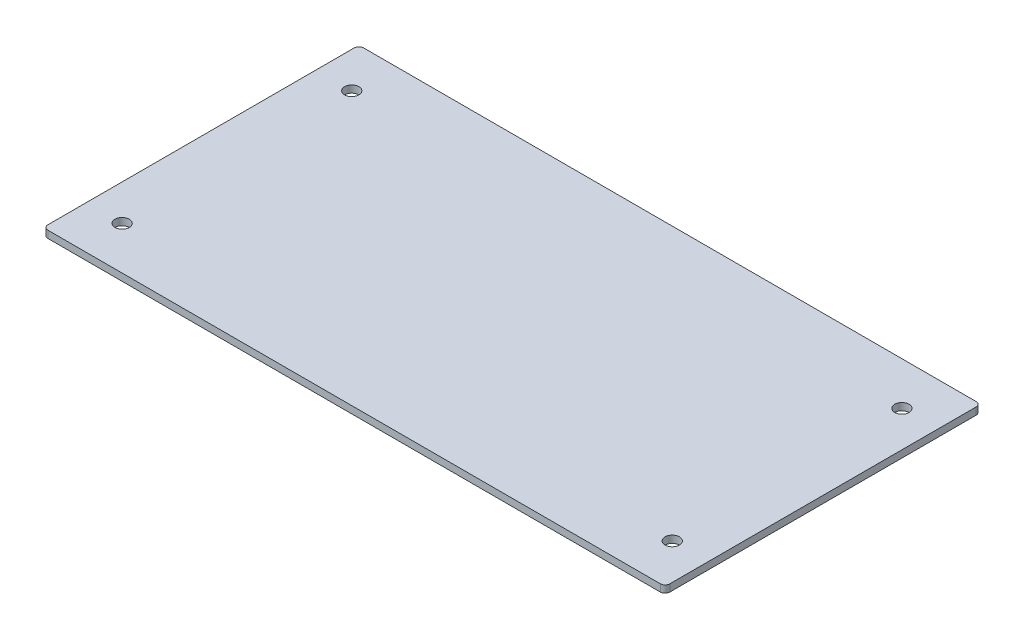
ISO-10303-21;
HEADER;
FILE_DESCRIPTION(('STEP AP214'),'2;1');
FILE_NAME('part.step','',(''),(''),'','','');
FILE_SCHEMA(('AUTOMOTIVE_DESIGN { 1 0 10303 214 1 1 1 1 }'));
ENDSEC;
DATA;
#1=APPLICATION_CONTEXT('core data for automotive mechanical design processes');
#2=APPLICATION_PROTOCOL_DEFINITION('international standard','automotive_design',2000,#1);
#3=PRODUCT_CONTEXT('',#1,'mechanical');
#4=PRODUCT('Part','Part','',(#3));
#5=PRODUCT_RELATED_PRODUCT_CATEGORY('part','',(#4));
#6=PRODUCT_DEFINITION_FORMATION('','',#4);
#7=PRODUCT_DEFINITION_CONTEXT('part definition',#1,'design');
#8=PRODUCT_DEFINITION('design','',#6,#7);
#9=PRODUCT_DEFINITION_SHAPE('','',#8);
#10=(LENGTH_UNIT() NAMED_UNIT(*) SI_UNIT(.MILLI.,.METRE.));
#11=(NAMED_UNIT(*) PLANE_ANGLE_UNIT() SI_UNIT($,.RADIAN.));
#12=(NAMED_UNIT(*) SI_UNIT($,.STERADIAN.) SOLID_ANGLE_UNIT());
#13=UNCERTAINTY_MEASURE_WITH_UNIT(LENGTH_MEASURE(1.E-05),#10,'distance_accuracy_value','');
#14=(GEOMETRIC_REPRESENTATION_CONTEXT(3) GLOBAL_UNCERTAINTY_ASSIGNED_CONTEXT((#13)) GLOBAL_UNIT_ASSIGNED_CONTEXT((#10,
#11,#12)) REPRESENTATION_CONTEXT('',''));
#15=CARTESIAN_POINT('',(0.,0.,0.));
#16=DIRECTION('',(0.,0.,1.));
#17=DIRECTION('',(1.,0.,0.));
#18=AXIS2_PLACEMENT_3D('',#15,#16,#17);
#19=CARTESIAN_POINT('',(0.,1.5,0.));
#20=DIRECTION('',(0.,1.,0.));
#21=DIRECTION('',(0.,0.,1.));
#22=AXIS2_PLACEMENT_3D('',#19,#20,#21);
#23=PLANE('',#22);
#24=CARTESIAN_POINT('',(-57.5,1.5,24.));
#25=DIRECTION('',(0.,1.,0.));
#26=DIRECTION('',(0.,0.,1.));
#27=AXIS2_PLACEMENT_3D('',#24,#25,#26);
#28=CIRCLE('',#27,1.5);
#29=CARTESIAN_POINT('',(-57.5,1.5,25.5));
#30=VERTEX_POINT('',#29);
#31=EDGE_CURVE('E182',#30,#30,#28,.T.);
#32=ORIENTED_EDGE('',*,*,#31,.F.);
#33=EDGE_LOOP('',(#32));
#34=FACE_BOUND('',#33,.T.);
#35=CARTESIAN_POINT('',(57.5,1.5,-24.));
#36=DIRECTION('',(0.,1.,0.));
#37=DIRECTION('',(0.,0.,1.));
#38=AXIS2_PLACEMENT_3D('',#35,#36,#37);
#39=CIRCLE('',#38,1.5);
#40=CARTESIAN_POINT('',(57.5,1.5,-22.5));
#41=VERTEX_POINT('',#40);
#42=EDGE_CURVE('E165',#41,#41,#39,.T.);
#43=ORIENTED_EDGE('',*,*,#42,.F.);
#44=EDGE_LOOP('',(#43));
#45=FACE_BOUND('',#44,.T.);
#46=DIRECTION('',(0.,0.,-1.));
#47=VECTOR('',#46,1.);
#48=CARTESIAN_POINT('',(65.,1.5,33.));
#49=LINE('',#48,#47);
#50=CARTESIAN_POINT('',(65.,1.5,32.));
#51=VERTEX_POINT('',#50);
#52=CARTESIAN_POINT('',(65.,1.5,-32.));
#53=VERTEX_POINT('',#52);
#54=EDGE_CURVE('E172',#51,#53,#49,.T.);
#55=ORIENTED_EDGE('',*,*,#54,.T.);
#56=CARTESIAN_POINT('',(64.,1.5,-32.));
#57=DIRECTION('',(0.,1.,0.));
#58=DIRECTION('',(0.,0.,1.));
#59=AXIS2_PLACEMENT_3D('',#56,#57,#58);
#60=CIRCLE('',#59,1.);
#61=CARTESIAN_POINT('',(64.,1.5,-33.));
#62=VERTEX_POINT('',#61);
#63=EDGE_CURVE('E149',#53,#62,#60,.T.);
#64=ORIENTED_EDGE('',*,*,#63,.T.);
#65=DIRECTION('',(-1.,0.,0.));
#66=VECTOR('',#65,1.);
#67=CARTESIAN_POINT('',(65.,1.5,-33.));
#68=LINE('',#67,#66);
#69=CARTESIAN_POINT('',(-64.,1.5,-33.));
#70=VERTEX_POINT('',#69);
#71=EDGE_CURVE('E120',#62,#70,#68,.T.);
#72=ORIENTED_EDGE('',*,*,#71,.T.);
#73=CARTESIAN_POINT('',(-64.,1.5,-32.));
#74=DIRECTION('',(0.,1.,0.));
#75=DIRECTION('',(0.,0.,1.));
#76=AXIS2_PLACEMENT_3D('',#73,#74,#75);
#77=CIRCLE('',#76,1.);
#78=CARTESIAN_POINT('',(-65.,1.5,-32.));
#79=VERTEX_POINT('',#78);
#80=EDGE_CURVE('E144',#70,#79,#77,.T.);
#81=ORIENTED_EDGE('',*,*,#80,.T.);
#82=DIRECTION('',(0.,0.,1.));
#83=VECTOR('',#82,1.);
#84=CARTESIAN_POINT('',(-65.,1.5,33.));
#85=LINE('',#84,#83);
#86=CARTESIAN_POINT('',(-65.,1.5,32.));
#87=VERTEX_POINT('',#86);
#88=EDGE_CURVE('E127',#79,#87,#85,.T.);
#89=ORIENTED_EDGE('',*,*,#88,.T.);
#90=CARTESIAN_POINT('',(-64.,1.5,32.));
#91=DIRECTION('',(0.,1.,0.));
#92=DIRECTION('',(0.,0.,1.));
#93=AXIS2_PLACEMENT_3D('',#90,#91,#92);
#94=CIRCLE('',#93,1.);
#95=CARTESIAN_POINT('',(-64.,1.5,33.));
#96=VERTEX_POINT('',#95);
#97=EDGE_CURVE('E56',#87,#96,#94,.T.);
#98=ORIENTED_EDGE('',*,*,#97,.T.);
#99=DIRECTION('',(1.,0.,0.));
#100=VECTOR('',#99,1.);
#101=CARTESIAN_POINT('',(65.,1.5,33.));
#102=LINE('',#101,#100);
#103=CARTESIAN_POINT('',(64.,1.5,33.));
#104=VERTEX_POINT('',#103);
#105=EDGE_CURVE('E130',#96,#104,#102,.T.);
#106=ORIENTED_EDGE('',*,*,#105,.T.);
#107=CARTESIAN_POINT('',(64.,1.5,32.));
#108=DIRECTION('',(0.,1.,0.));
#109=DIRECTION('',(0.,0.,1.));
#110=AXIS2_PLACEMENT_3D('',#107,#108,#109);
#111=CIRCLE('',#110,1.);
#112=EDGE_CURVE('E147',#104,#51,#111,.T.);
#113=ORIENTED_EDGE('',*,*,#112,.T.);
#114=EDGE_LOOP('',(#55,#64,#72,#81,#89,#98,#106,#113));
#115=FACE_BOUND('',#114,.T.);
#116=CARTESIAN_POINT('',(-57.5,1.5,-24.));
#117=DIRECTION('',(0.,1.,0.));
#118=DIRECTION('',(0.,0.,-1.));
#119=AXIS2_PLACEMENT_3D('',#116,#117,#118);
#120=CIRCLE('',#119,1.5);
#121=CARTESIAN_POINT('',(-57.5,1.5,-25.5));
#122=VERTEX_POINT('',#121);
#123=EDGE_CURVE('E177',#122,#122,#120,.T.);
#124=ORIENTED_EDGE('',*,*,#123,.F.);
#125=EDGE_LOOP('',(#124));
#126=FACE_BOUND('',#125,.T.);
#127=CARTESIAN_POINT('',(57.5,1.5,24.));
#128=DIRECTION('',(0.,1.,0.));
#129=DIRECTION('',(0.,0.,-1.));
#130=AXIS2_PLACEMENT_3D('',#127,#128,#129);
#131=CIRCLE('',#130,1.5);
#132=CARTESIAN_POINT('',(57.5,1.5,22.5));
#133=VERTEX_POINT('',#132);
#134=EDGE_CURVE('E188',#133,#133,#131,.T.);
#135=ORIENTED_EDGE('',*,*,#134,.F.);
#136=EDGE_LOOP('',(#135));
#137=FACE_BOUND('',#136,.T.);
#138=ADVANCED_FACE('F34',(#34,#45,#115,#126,#137),#23,.T.);
#139=CARTESIAN_POINT('',(0.,0.,0.));
#140=DIRECTION('',(0.,1.,0.));
#141=DIRECTION('',(0.,0.,1.));
#142=AXIS2_PLACEMENT_3D('',#139,#140,#141);
#143=PLANE('',#142);
#144=DIRECTION('',(-1.,0.,0.));
#145=VECTOR('',#144,1.);
#146=CARTESIAN_POINT('',(65.,0.,-33.));
#147=LINE('',#146,#145);
#148=CARTESIAN_POINT('',(64.,0.,-33.));
#149=VERTEX_POINT('',#148);
#150=CARTESIAN_POINT('',(-64.,0.,-33.));
#151=VERTEX_POINT('',#150);
#152=EDGE_CURVE('E117',#149,#151,#147,.T.);
#153=ORIENTED_EDGE('',*,*,#152,.F.);
#154=CARTESIAN_POINT('',(64.,0.,-32.));
#155=DIRECTION('',(0.,1.,0.));
#156=DIRECTION('',(0.,0.,1.));
#157=AXIS2_PLACEMENT_3D('',#154,#155,#156);
#158=CIRCLE('',#157,1.);
#159=CARTESIAN_POINT('',(65.,0.,-32.));
#160=VERTEX_POINT('',#159);
#161=EDGE_CURVE('E100',#149,#160,#158,.F.);
#162=ORIENTED_EDGE('',*,*,#161,.T.);
#163=DIRECTION('',(0.,0.,-1.));
#164=VECTOR('',#163,1.);
#165=CARTESIAN_POINT('',(65.,0.,33.));
#166=LINE('',#165,#164);
#167=CARTESIAN_POINT('',(65.,0.,32.));
#168=VERTEX_POINT('',#167);
#169=EDGE_CURVE('E128',#168,#160,#166,.T.);
#170=ORIENTED_EDGE('',*,*,#169,.F.);
#171=CARTESIAN_POINT('',(64.,0.,32.));
#172=DIRECTION('',(0.,1.,0.));
#173=DIRECTION('',(0.,0.,1.));
#174=AXIS2_PLACEMENT_3D('',#171,#172,#173);
#175=CIRCLE('',#174,1.);
#176=CARTESIAN_POINT('',(64.,0.,33.));
#177=VERTEX_POINT('',#176);
#178=EDGE_CURVE('E111',#168,#177,#175,.F.);
#179=ORIENTED_EDGE('',*,*,#178,.T.);
#180=DIRECTION('',(1.,0.,0.));
#181=VECTOR('',#180,1.);
#182=CARTESIAN_POINT('',(65.,0.,33.));
#183=LINE('',#182,#181);
#184=CARTESIAN_POINT('',(-64.,0.,33.));
#185=VERTEX_POINT('',#184);
#186=EDGE_CURVE('E132',#185,#177,#183,.T.);
#187=ORIENTED_EDGE('',*,*,#186,.F.);
#188=CARTESIAN_POINT('',(-64.,0.,32.));
#189=DIRECTION('',(0.,1.,0.));
#190=DIRECTION('',(0.,0.,1.));
#191=AXIS2_PLACEMENT_3D('',#188,#189,#190);
#192=CIRCLE('',#191,1.);
#193=CARTESIAN_POINT('',(-65.,0.,32.));
#194=VERTEX_POINT('',#193);
#195=EDGE_CURVE('E138',#185,#194,#192,.F.);
#196=ORIENTED_EDGE('',*,*,#195,.T.);
#197=DIRECTION('',(0.,0.,1.));
#198=VECTOR('',#197,1.);
#199=CARTESIAN_POINT('',(-65.,0.,33.));
#200=LINE('',#199,#198);
#201=CARTESIAN_POINT('',(-65.,0.,-32.));
#202=VERTEX_POINT('',#201);
#203=EDGE_CURVE('E160',#202,#194,#200,.T.);
#204=ORIENTED_EDGE('',*,*,#203,.F.);
#205=CARTESIAN_POINT('',(-64.,0.,-32.));
#206=DIRECTION('',(0.,1.,0.));
#207=DIRECTION('',(0.,0.,1.));
#208=AXIS2_PLACEMENT_3D('',#205,#206,#207);
#209=CIRCLE('',#208,1.);
#210=EDGE_CURVE('E121',#202,#151,#209,.F.);
#211=ORIENTED_EDGE('',*,*,#210,.T.);
#212=EDGE_LOOP('',(#153,#162,#170,#179,#187,#196,#204,#211));
#213=FACE_BOUND('',#212,.T.);
#214=CARTESIAN_POINT('',(57.5,0.,-24.));
#215=DIRECTION('',(0.,1.,0.));
#216=DIRECTION('',(0.,0.,1.));
#217=AXIS2_PLACEMENT_3D('',#214,#215,#216);
#218=CIRCLE('',#217,1.5);
#219=CARTESIAN_POINT('',(57.5,0.,-22.5));
#220=VERTEX_POINT('',#219);
#221=EDGE_CURVE('E168',#220,#220,#218,.T.);
#222=ORIENTED_EDGE('',*,*,#221,.T.);
#223=EDGE_LOOP('',(#222));
#224=FACE_BOUND('',#223,.T.);
#225=CARTESIAN_POINT('',(-57.5,0.,-24.));
#226=DIRECTION('',(0.,1.,0.));
#227=DIRECTION('',(0.,0.,-1.));
#228=AXIS2_PLACEMENT_3D('',#225,#226,#227);
#229=CIRCLE('',#228,1.5);
#230=CARTESIAN_POINT('',(-57.5,0.,-25.5));
#231=VERTEX_POINT('',#230);
#232=EDGE_CURVE('E179',#231,#231,#229,.T.);
#233=ORIENTED_EDGE('',*,*,#232,.T.);
#234=EDGE_LOOP('',(#233));
#235=FACE_BOUND('',#234,.T.);
#236=CARTESIAN_POINT('',(-57.5,0.,24.));
#237=DIRECTION('',(0.,1.,0.));
#238=DIRECTION('',(0.,0.,1.));
#239=AXIS2_PLACEMENT_3D('',#236,#237,#238);
#240=CIRCLE('',#239,1.5);
#241=CARTESIAN_POINT('',(-57.5,0.,25.5));
#242=VERTEX_POINT('',#241);
#243=EDGE_CURVE('E185',#242,#242,#240,.T.);
#244=ORIENTED_EDGE('',*,*,#243,.T.);
#245=EDGE_LOOP('',(#244));
#246=FACE_BOUND('',#245,.T.);
#247=CARTESIAN_POINT('',(57.5,0.,24.));
#248=DIRECTION('',(0.,1.,0.));
#249=DIRECTION('',(0.,0.,-1.));
#250=AXIS2_PLACEMENT_3D('',#247,#248,#249);
#251=CIRCLE('',#250,1.5);
#252=CARTESIAN_POINT('',(57.5,0.,22.5));
#253=VERTEX_POINT('',#252);
#254=EDGE_CURVE('E191',#253,#253,#251,.T.);
#255=ORIENTED_EDGE('',*,*,#254,.T.);
#256=EDGE_LOOP('',(#255));
#257=FACE_BOUND('',#256,.T.);
#258=ADVANCED_FACE('F124',(#213,#224,#235,#246,#257),#143,.F.);
#259=CARTESIAN_POINT('',(-65.,1.5,33.));
#260=DIRECTION('',(1.,0.,0.));
#261=DIRECTION('',(0.,0.,-1.));
#262=AXIS2_PLACEMENT_3D('',#259,#260,#261);
#263=PLANE('',#262);
#264=ORIENTED_EDGE('',*,*,#203,.T.);
#265=DIRECTION('',(0.,-1.,0.));
#266=VECTOR('',#265,1.);
#267=CARTESIAN_POINT('',(-65.,1.5,32.));
#268=LINE('',#267,#266);
#269=EDGE_CURVE('E11',#194,#87,#268,.F.);
#270=ORIENTED_EDGE('',*,*,#269,.T.);
#271=ORIENTED_EDGE('',*,*,#88,.F.);
#272=DIRECTION('',(0.,-1.,0.));
#273=VECTOR('',#272,1.);
#274=CARTESIAN_POINT('',(-65.,1.5,-32.));
#275=LINE('',#274,#273);
#276=EDGE_CURVE('E42',#79,#202,#275,.T.);
#277=ORIENTED_EDGE('',*,*,#276,.T.);
#278=EDGE_LOOP('',(#264,#270,#271,#277));
#279=FACE_BOUND('',#278,.T.);
#280=ADVANCED_FACE('F159',(#279),#263,.F.);
#281=CARTESIAN_POINT('',(65.,1.5,33.));
#282=DIRECTION('',(0.,0.,-1.));
#283=DIRECTION('',(-1.,0.,0.));
#284=AXIS2_PLACEMENT_3D('',#281,#282,#283);
#285=PLANE('',#284);
#286=ORIENTED_EDGE('',*,*,#186,.T.);
#287=DIRECTION('',(0.,-1.,0.));
#288=VECTOR('',#287,1.);
#289=CARTESIAN_POINT('',(64.,1.5,33.));
#290=LINE('',#289,#288);
#291=EDGE_CURVE('E49',#177,#104,#290,.F.);
#292=ORIENTED_EDGE('',*,*,#291,.T.);
#293=ORIENTED_EDGE('',*,*,#105,.F.);
#294=DIRECTION('',(0.,-1.,0.));
#295=VECTOR('',#294,1.);
#296=CARTESIAN_POINT('',(-64.,1.5,33.));
#297=LINE('',#296,#295);
#298=EDGE_CURVE('E151',#96,#185,#297,.T.);
#299=ORIENTED_EDGE('',*,*,#298,.T.);
#300=EDGE_LOOP('',(#286,#292,#293,#299));
#301=FACE_BOUND('',#300,.T.);
#302=ADVANCED_FACE('F218',(#301),#285,.F.);
#303=CARTESIAN_POINT('',(65.,1.5,33.));
#304=DIRECTION('',(-1.,0.,0.));
#305=DIRECTION('',(0.,0.,1.));
#306=AXIS2_PLACEMENT_3D('',#303,#304,#305);
#307=PLANE('',#306);
#308=ORIENTED_EDGE('',*,*,#169,.T.);
#309=DIRECTION('',(0.,-1.,0.));
#310=VECTOR('',#309,1.);
#311=CARTESIAN_POINT('',(65.,1.5,-32.));
#312=LINE('',#311,#310);
#313=EDGE_CURVE('E105',#160,#53,#312,.F.);
#314=ORIENTED_EDGE('',*,*,#313,.T.);
#315=ORIENTED_EDGE('',*,*,#54,.F.);
#316=DIRECTION('',(0.,-1.,0.));
#317=VECTOR('',#316,1.);
#318=CARTESIAN_POINT('',(65.,1.5,32.));
#319=LINE('',#318,#317);
#320=EDGE_CURVE('E110',#51,#168,#319,.T.);
#321=ORIENTED_EDGE('',*,*,#320,.T.);
#322=EDGE_LOOP('',(#308,#314,#315,#321));
#323=FACE_BOUND('',#322,.T.);
#324=ADVANCED_FACE('F215',(#323),#307,.F.);
#325=CARTESIAN_POINT('',(65.,1.5,-33.));
#326=DIRECTION('',(0.,0.,1.));
#327=DIRECTION('',(1.,0.,0.));
#328=AXIS2_PLACEMENT_3D('',#325,#326,#327);
#329=PLANE('',#328);
#330=ORIENTED_EDGE('',*,*,#71,.F.);
#331=DIRECTION('',(0.,-1.,0.));
#332=VECTOR('',#331,1.);
#333=CARTESIAN_POINT('',(64.,1.5,-33.));
#334=LINE('',#333,#332);
#335=EDGE_CURVE('E104',#62,#149,#334,.T.);
#336=ORIENTED_EDGE('',*,*,#335,.T.);
#337=ORIENTED_EDGE('',*,*,#152,.T.);
#338=DIRECTION('',(0.,-1.,0.));
#339=VECTOR('',#338,1.);
#340=CARTESIAN_POINT('',(-64.,1.5,-33.));
#341=LINE('',#340,#339);
#342=EDGE_CURVE('E122',#151,#70,#341,.F.);
#343=ORIENTED_EDGE('',*,*,#342,.T.);
#344=EDGE_LOOP('',(#330,#336,#337,#343));
#345=FACE_BOUND('',#344,.T.);
#346=ADVANCED_FACE('F116',(#345),#329,.F.);
#347=CARTESIAN_POINT('',(57.5,1.5,-24.));
#348=DIRECTION('',(0.,-1.,0.));
#349=DIRECTION('',(0.,0.,-1.));
#350=AXIS2_PLACEMENT_3D('',#347,#348,#349);
#351=CYLINDRICAL_SURFACE('',#350,1.5);
#352=ORIENTED_EDGE('',*,*,#42,.T.);
#353=EDGE_LOOP('',(#352));
#354=FACE_BOUND('',#353,.T.);
#355=ORIENTED_EDGE('',*,*,#221,.F.);
#356=EDGE_LOOP('',(#355));
#357=FACE_BOUND('',#356,.T.);
#358=ADVANCED_FACE('F210',(#354,#357),#351,.F.);
#359=CARTESIAN_POINT('',(-57.5,1.5,-24.));
#360=DIRECTION('',(0.,-1.,0.));
#361=DIRECTION('',(0.,0.,-1.));
#362=AXIS2_PLACEMENT_3D('',#359,#360,#361);
#363=CYLINDRICAL_SURFACE('',#362,1.5);
#364=ORIENTED_EDGE('',*,*,#123,.T.);
#365=EDGE_LOOP('',(#364));
#366=FACE_BOUND('',#365,.T.);
#367=ORIENTED_EDGE('',*,*,#232,.F.);
#368=EDGE_LOOP('',(#367));
#369=FACE_BOUND('',#368,.T.);
#370=ADVANCED_FACE('F242',(#366,#369),#363,.F.);
#371=CARTESIAN_POINT('',(-57.5,1.5,24.));
#372=DIRECTION('',(0.,-1.,0.));
#373=DIRECTION('',(0.,0.,-1.));
#374=AXIS2_PLACEMENT_3D('',#371,#372,#373);
#375=CYLINDRICAL_SURFACE('',#374,1.5);
#376=ORIENTED_EDGE('',*,*,#31,.T.);
#377=EDGE_LOOP('',(#376));
#378=FACE_BOUND('',#377,.T.);
#379=ORIENTED_EDGE('',*,*,#243,.F.);
#380=EDGE_LOOP('',(#379));
#381=FACE_BOUND('',#380,.T.);
#382=ADVANCED_FACE('F245',(#378,#381),#375,.F.);
#383=CARTESIAN_POINT('',(57.5,1.5,24.));
#384=DIRECTION('',(0.,-1.,0.));
#385=DIRECTION('',(0.,0.,-1.));
#386=AXIS2_PLACEMENT_3D('',#383,#384,#385);
#387=CYLINDRICAL_SURFACE('',#386,1.5);
#388=ORIENTED_EDGE('',*,*,#134,.T.);
#389=EDGE_LOOP('',(#388));
#390=FACE_BOUND('',#389,.T.);
#391=ORIENTED_EDGE('',*,*,#254,.F.);
#392=EDGE_LOOP('',(#391));
#393=FACE_BOUND('',#392,.T.);
#394=ADVANCED_FACE('F197',(#390,#393),#387,.F.);
#395=CARTESIAN_POINT('',(64.,1.5,-32.));
#396=DIRECTION('',(0.,-1.,0.));
#397=DIRECTION('',(0.,0.,-1.));
#398=AXIS2_PLACEMENT_3D('',#395,#396,#397);
#399=CYLINDRICAL_SURFACE('',#398,1.);
#400=ORIENTED_EDGE('',*,*,#63,.F.);
#401=ORIENTED_EDGE('',*,*,#313,.F.);
#402=ORIENTED_EDGE('',*,*,#161,.F.);
#403=ORIENTED_EDGE('',*,*,#335,.F.);
#404=EDGE_LOOP('',(#400,#401,#402,#403));
#405=FACE_BOUND('',#404,.T.);
#406=ADVANCED_FACE('F103',(#405),#399,.T.);
#407=CARTESIAN_POINT('',(64.,1.5,32.));
#408=DIRECTION('',(0.,-1.,0.));
#409=DIRECTION('',(0.,0.,-1.));
#410=AXIS2_PLACEMENT_3D('',#407,#408,#409);
#411=CYLINDRICAL_SURFACE('',#410,1.);
#412=ORIENTED_EDGE('',*,*,#112,.F.);
#413=ORIENTED_EDGE('',*,*,#291,.F.);
#414=ORIENTED_EDGE('',*,*,#178,.F.);
#415=ORIENTED_EDGE('',*,*,#320,.F.);
#416=EDGE_LOOP('',(#412,#413,#414,#415));
#417=FACE_BOUND('',#416,.T.);
#418=ADVANCED_FACE('F226',(#417),#411,.T.);
#419=CARTESIAN_POINT('',(-64.,1.5,32.));
#420=DIRECTION('',(0.,-1.,0.));
#421=DIRECTION('',(0.,0.,-1.));
#422=AXIS2_PLACEMENT_3D('',#419,#420,#421);
#423=CYLINDRICAL_SURFACE('',#422,1.);
#424=ORIENTED_EDGE('',*,*,#97,.F.);
#425=ORIENTED_EDGE('',*,*,#269,.F.);
#426=ORIENTED_EDGE('',*,*,#195,.F.);
#427=ORIENTED_EDGE('',*,*,#298,.F.);
#428=EDGE_LOOP('',(#424,#425,#426,#427));
#429=FACE_BOUND('',#428,.T.);
#430=ADVANCED_FACE('F228',(#429),#423,.T.);
#431=CARTESIAN_POINT('',(-64.,1.5,-32.));
#432=DIRECTION('',(0.,-1.,0.));
#433=DIRECTION('',(0.,0.,-1.));
#434=AXIS2_PLACEMENT_3D('',#431,#432,#433);
#435=CYLINDRICAL_SURFACE('',#434,1.);
#436=ORIENTED_EDGE('',*,*,#80,.F.);
#437=ORIENTED_EDGE('',*,*,#342,.F.);
#438=ORIENTED_EDGE('',*,*,#210,.F.);
#439=ORIENTED_EDGE('',*,*,#276,.F.);
#440=EDGE_LOOP('',(#436,#437,#438,#439));
#441=FACE_BOUND('',#440,.T.);
#442=ADVANCED_FACE('F36',(#441),#435,.T.);
#443=CLOSED_SHELL('',(#138,#258,#280,#302,#324,#346,#358,#370,#382,#394,#406,#418,#430,#442));
#444=MANIFOLD_SOLID_BREP('B2',#443);
#445=ADVANCED_BREP_SHAPE_REPRESENTATION('',(#18,#444),#14);
#446=SHAPE_DEFINITION_REPRESENTATION(#9,#445);
ENDSEC;
END-ISO-10303-21;
